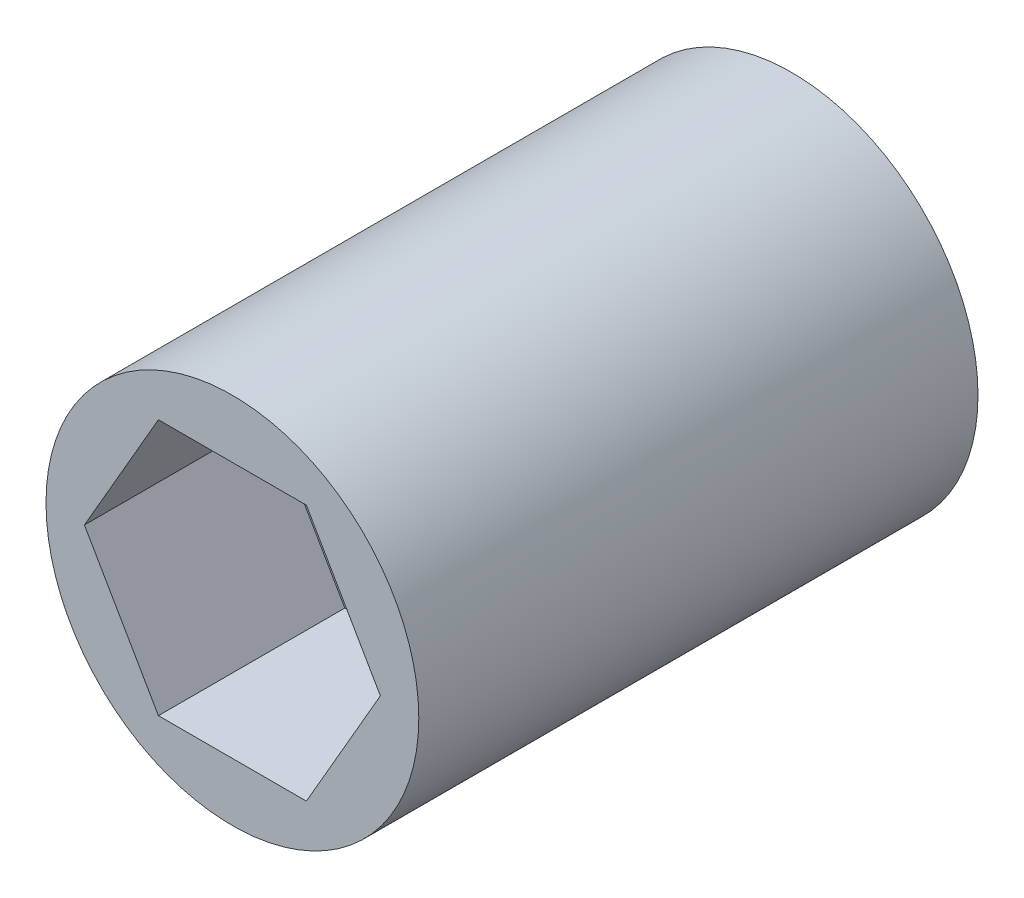
ISO-10303-21;
HEADER;
FILE_DESCRIPTION(('STEP AP214'),'2;1');
FILE_NAME('part.step','',(''),(''),'','','');
FILE_SCHEMA(('AUTOMOTIVE_DESIGN { 1 0 10303 214 1 1 1 1 }'));
ENDSEC;
DATA;
#1=APPLICATION_CONTEXT('core data for automotive mechanical design processes');
#2=APPLICATION_PROTOCOL_DEFINITION('international standard','automotive_design',2000,#1);
#3=PRODUCT_CONTEXT('',#1,'mechanical');
#4=PRODUCT('Part','Part','',(#3));
#5=PRODUCT_RELATED_PRODUCT_CATEGORY('part','',(#4));
#6=PRODUCT_DEFINITION_FORMATION('','',#4);
#7=PRODUCT_DEFINITION_CONTEXT('part definition',#1,'design');
#8=PRODUCT_DEFINITION('design','',#6,#7);
#9=PRODUCT_DEFINITION_SHAPE('','',#8);
#10=(LENGTH_UNIT() NAMED_UNIT(*) SI_UNIT(.MILLI.,.METRE.));
#11=(NAMED_UNIT(*) PLANE_ANGLE_UNIT() SI_UNIT($,.RADIAN.));
#12=(NAMED_UNIT(*) SI_UNIT($,.STERADIAN.) SOLID_ANGLE_UNIT());
#13=UNCERTAINTY_MEASURE_WITH_UNIT(LENGTH_MEASURE(1.E-05),#10,'distance_accuracy_value','');
#14=(GEOMETRIC_REPRESENTATION_CONTEXT(3) GLOBAL_UNCERTAINTY_ASSIGNED_CONTEXT((#13)) GLOBAL_UNIT_ASSIGNED_CONTEXT((#10,
#11,#12)) REPRESENTATION_CONTEXT('',''));
#15=CARTESIAN_POINT('',(0.,0.,0.));
#16=DIRECTION('',(0.,0.,1.));
#17=DIRECTION('',(1.,0.,0.));
#18=AXIS2_PLACEMENT_3D('',#15,#16,#17);
#19=CARTESIAN_POINT('',(0.,0.,0.));
#20=DIRECTION('',(0.,0.,1.));
#21=DIRECTION('',(1.,0.,0.));
#22=AXIS2_PLACEMENT_3D('',#19,#20,#21);
#23=PLANE('',#22);
#24=CARTESIAN_POINT('',(0.,0.,0.));
#25=DIRECTION('',(0.,0.,-1.));
#26=DIRECTION('',(-1.,0.,0.));
#27=AXIS2_PLACEMENT_3D('',#24,#25,#26);
#28=CIRCLE('',#27,1.5);
#29=CARTESIAN_POINT('',(1.5,0.,0.));
#30=VERTEX_POINT('',#29);
#31=EDGE_CURVE('E165',#30,#30,#28,.T.);
#32=ORIENTED_EDGE('',*,*,#31,.F.);
#33=EDGE_LOOP('',(#32));
#34=FACE_BOUND('',#33,.T.);
#35=CARTESIAN_POINT('',(0.,0.,0.));
#36=DIRECTION('',(0.,0.,1.));
#37=DIRECTION('',(1.,0.,0.));
#38=AXIS2_PLACEMENT_3D('',#35,#36,#37);
#39=CIRCLE('',#38,4.);
#40=CARTESIAN_POINT('',(4.,0.,0.));
#41=VERTEX_POINT('',#40);
#42=CARTESIAN_POINT('',(-4.,0.,0.));
#43=VERTEX_POINT('',#42);
#44=EDGE_CURVE('E10',#41,#43,#39,.T.);
#45=ORIENTED_EDGE('',*,*,#44,.F.);
#46=CARTESIAN_POINT('',(0.,0.,0.));
#47=DIRECTION('',(0.,0.,1.));
#48=DIRECTION('',(1.,0.,0.));
#49=AXIS2_PLACEMENT_3D('',#46,#47,#48);
#50=CIRCLE('',#49,4.);
#51=EDGE_CURVE('E26',#43,#41,#50,.T.);
#52=ORIENTED_EDGE('',*,*,#51,.F.);
#53=EDGE_LOOP('',(#45,#52));
#54=FACE_BOUND('',#53,.T.);
#55=ADVANCED_FACE('F15',(#34,#54),#23,.F.);
#56=CARTESIAN_POINT('',(0.,0.,12.));
#57=DIRECTION('',(0.,0.,1.));
#58=DIRECTION('',(1.,0.,0.));
#59=AXIS2_PLACEMENT_3D('',#56,#57,#58);
#60=PLANE('',#59);
#61=DIRECTION('',(-1.,0.,0.));
#62=VECTOR('',#61,1.);
#63=CARTESIAN_POINT('',(0.793856620135737,-2.75,12.));
#64=LINE('',#63,#62);
#65=CARTESIAN_POINT('',(1.58771324027147,-2.75,12.));
#66=VERTEX_POINT('',#65);
#67=CARTESIAN_POINT('',(-1.58771324027147,-2.75,12.));
#68=VERTEX_POINT('',#67);
#69=EDGE_CURVE('E127',#66,#68,#64,.T.);
#70=ORIENTED_EDGE('',*,*,#69,.T.);
#71=DIRECTION('',(-0.5,0.866025403784439,0.));
#72=VECTOR('',#71,1.);
#73=CARTESIAN_POINT('',(-1.98464155033934,-2.0625,12.));
#74=LINE('',#73,#72);
#75=CARTESIAN_POINT('',(-3.17542648054294,0.,12.));
#76=VERTEX_POINT('',#75);
#77=EDGE_CURVE('E111',#68,#76,#74,.T.);
#78=ORIENTED_EDGE('',*,*,#77,.T.);
#79=DIRECTION('',(0.5,0.866025403784439,0.));
#80=VECTOR('',#79,1.);
#81=CARTESIAN_POINT('',(-2.77849817047508,0.6875,12.));
#82=LINE('',#81,#80);
#83=CARTESIAN_POINT('',(-1.58771324027147,2.75,12.));
#84=VERTEX_POINT('',#83);
#85=EDGE_CURVE('E157',#76,#84,#82,.T.);
#86=ORIENTED_EDGE('',*,*,#85,.T.);
#87=DIRECTION('',(1.,0.,0.));
#88=VECTOR('',#87,1.);
#89=CARTESIAN_POINT('',(-0.793856620135739,2.75,12.));
#90=LINE('',#89,#88);
#91=CARTESIAN_POINT('',(1.58771324027147,2.75,12.));
#92=VERTEX_POINT('',#91);
#93=EDGE_CURVE('E186',#84,#92,#90,.T.);
#94=ORIENTED_EDGE('',*,*,#93,.T.);
#95=DIRECTION('',(0.5,-0.866025403784439,0.));
#96=VECTOR('',#95,1.);
#97=CARTESIAN_POINT('',(1.98464155033934,2.0625,12.));
#98=LINE('',#97,#96);
#99=CARTESIAN_POINT('',(3.17542648054294,0.,12.));
#100=VERTEX_POINT('',#99);
#101=EDGE_CURVE('E152',#92,#100,#98,.T.);
#102=ORIENTED_EDGE('',*,*,#101,.T.);
#103=DIRECTION('',(-0.5,-0.866025403784439,0.));
#104=VECTOR('',#103,1.);
#105=CARTESIAN_POINT('',(2.77849817047507,-0.6875,12.));
#106=LINE('',#105,#104);
#107=EDGE_CURVE('E131',#100,#66,#106,.T.);
#108=ORIENTED_EDGE('',*,*,#107,.T.);
#109=EDGE_LOOP('',(#70,#78,#86,#94,#102,#108));
#110=FACE_BOUND('',#109,.T.);
#111=CARTESIAN_POINT('',(0.,0.,12.));
#112=DIRECTION('',(0.,0.,1.));
#113=DIRECTION('',(1.,0.,0.));
#114=AXIS2_PLACEMENT_3D('',#111,#112,#113);
#115=CIRCLE('',#114,4.);
#116=CARTESIAN_POINT('',(4.,0.,12.));
#117=VERTEX_POINT('',#116);
#118=CARTESIAN_POINT('',(-4.,0.,12.));
#119=VERTEX_POINT('',#118);
#120=EDGE_CURVE('E161',#117,#119,#115,.T.);
#121=ORIENTED_EDGE('',*,*,#120,.T.);
#122=CARTESIAN_POINT('',(0.,0.,12.));
#123=DIRECTION('',(0.,0.,1.));
#124=DIRECTION('',(1.,0.,0.));
#125=AXIS2_PLACEMENT_3D('',#122,#123,#124);
#126=CIRCLE('',#125,4.);
#127=EDGE_CURVE('E151',#119,#117,#126,.T.);
#128=ORIENTED_EDGE('',*,*,#127,.T.);
#129=EDGE_LOOP('',(#121,#128));
#130=FACE_BOUND('',#129,.T.);
#131=ADVANCED_FACE('F133',(#110,#130),#60,.T.);
#132=CARTESIAN_POINT('',(0.,0.,0.));
#133=DIRECTION('',(0.,0.,1.));
#134=DIRECTION('',(1.,0.,0.));
#135=AXIS2_PLACEMENT_3D('',#132,#133,#134);
#136=CYLINDRICAL_SURFACE('',#135,4.);
#137=ORIENTED_EDGE('',*,*,#120,.F.);
#138=ORIENTED_EDGE('',*,*,#127,.F.);
#139=DIRECTION('',(0.,0.,-1.));
#140=VECTOR('',#139,1.);
#141=CARTESIAN_POINT('',(-4.,0.,0.));
#142=LINE('',#141,#140);
#143=EDGE_CURVE('E147',#119,#43,#142,.T.);
#144=ORIENTED_EDGE('',*,*,#143,.T.);
#145=ORIENTED_EDGE('',*,*,#51,.T.);
#146=ORIENTED_EDGE('',*,*,#44,.T.);
#147=ORIENTED_EDGE('',*,*,#143,.F.);
#148=EDGE_LOOP('',(#137,#138,#144,#145,#146,#147));
#149=FACE_BOUND('',#148,.T.);
#150=ADVANCED_FACE('F198',(#149),#136,.T.);
#151=CARTESIAN_POINT('',(0.,0.,0.));
#152=DIRECTION('',(0.,0.,1.));
#153=DIRECTION('',(-1.,0.,0.));
#154=AXIS2_PLACEMENT_3D('',#151,#152,#153);
#155=CYLINDRICAL_SURFACE('',#154,1.5);
#156=CARTESIAN_POINT('',(0.,0.,8.));
#157=DIRECTION('',(0.,0.,1.));
#158=DIRECTION('',(-1.,0.,0.));
#159=AXIS2_PLACEMENT_3D('',#156,#157,#158);
#160=CIRCLE('',#159,1.5);
#161=CARTESIAN_POINT('',(1.5,0.,8.));
#162=VERTEX_POINT('',#161);
#163=EDGE_CURVE('E168',#162,#162,#160,.T.);
#164=ORIENTED_EDGE('',*,*,#163,.T.);
#165=DIRECTION('',(0.,0.,-1.));
#166=VECTOR('',#165,1.);
#167=CARTESIAN_POINT('',(1.5,0.,0.));
#168=LINE('',#167,#166);
#169=EDGE_CURVE('E101',#162,#30,#168,.T.);
#170=ORIENTED_EDGE('',*,*,#169,.T.);
#171=ORIENTED_EDGE('',*,*,#31,.T.);
#172=ORIENTED_EDGE('',*,*,#169,.F.);
#173=EDGE_LOOP('',(#164,#170,#171,#172));
#174=FACE_BOUND('',#173,.T.);
#175=ADVANCED_FACE('F214',(#174),#155,.F.);
#176=CARTESIAN_POINT('',(0.,0.,8.));
#177=DIRECTION('',(0.,0.,-1.));
#178=DIRECTION('',(0.,-1.,0.));
#179=AXIS2_PLACEMENT_3D('',#176,#177,#178);
#180=PLANE('',#179);
#181=ORIENTED_EDGE('',*,*,#163,.F.);
#182=EDGE_LOOP('',(#181));
#183=FACE_BOUND('',#182,.T.);
#184=DIRECTION('',(-0.5,0.866025403784439,0.));
#185=VECTOR('',#184,1.);
#186=CARTESIAN_POINT('',(-3.17542648054294,0.,8.));
#187=LINE('',#186,#185);
#188=CARTESIAN_POINT('',(-1.58771324027147,-2.75,8.));
#189=VERTEX_POINT('',#188);
#190=CARTESIAN_POINT('',(-3.17542648054294,0.,8.));
#191=VERTEX_POINT('',#190);
#192=EDGE_CURVE('E90',#189,#191,#187,.T.);
#193=ORIENTED_EDGE('',*,*,#192,.F.);
#194=DIRECTION('',(-1.,0.,0.));
#195=VECTOR('',#194,1.);
#196=CARTESIAN_POINT('',(-1.58771324027147,-2.75,8.));
#197=LINE('',#196,#195);
#198=CARTESIAN_POINT('',(1.58771324027147,-2.75,8.));
#199=VERTEX_POINT('',#198);
#200=EDGE_CURVE('E129',#199,#189,#197,.T.);
#201=ORIENTED_EDGE('',*,*,#200,.F.);
#202=DIRECTION('',(-0.5,-0.866025403784439,0.));
#203=VECTOR('',#202,1.);
#204=CARTESIAN_POINT('',(1.58771324027147,-2.75,8.));
#205=LINE('',#204,#203);
#206=CARTESIAN_POINT('',(3.17542648054294,0.,8.));
#207=VERTEX_POINT('',#206);
#208=EDGE_CURVE('E156',#207,#199,#205,.T.);
#209=ORIENTED_EDGE('',*,*,#208,.F.);
#210=DIRECTION('',(0.5,-0.866025403784439,0.));
#211=VECTOR('',#210,1.);
#212=CARTESIAN_POINT('',(3.17542648054294,0.,8.));
#213=LINE('',#212,#211);
#214=CARTESIAN_POINT('',(1.58771324027147,2.75,8.));
#215=VERTEX_POINT('',#214);
#216=EDGE_CURVE('E238',#215,#207,#213,.T.);
#217=ORIENTED_EDGE('',*,*,#216,.F.);
#218=DIRECTION('',(1.,0.,0.));
#219=VECTOR('',#218,1.);
#220=CARTESIAN_POINT('',(1.58771324027147,2.75,8.));
#221=LINE('',#220,#219);
#222=CARTESIAN_POINT('',(-1.58771324027147,2.75,8.));
#223=VERTEX_POINT('',#222);
#224=EDGE_CURVE('E160',#223,#215,#221,.T.);
#225=ORIENTED_EDGE('',*,*,#224,.F.);
#226=DIRECTION('',(0.5,0.866025403784439,0.));
#227=VECTOR('',#226,1.);
#228=CARTESIAN_POINT('',(-1.58771324027147,2.75,8.));
#229=LINE('',#228,#227);
#230=EDGE_CURVE('E121',#191,#223,#229,.T.);
#231=ORIENTED_EDGE('',*,*,#230,.F.);
#232=EDGE_LOOP('',(#193,#201,#209,#217,#225,#231));
#233=FACE_BOUND('',#232,.T.);
#234=ADVANCED_FACE('F217',(#183,#233),#180,.F.);
#235=CARTESIAN_POINT('',(-1.58771324027147,-2.75,12.));
#236=DIRECTION('',(-0.866025403784439,-0.5,0.));
#237=DIRECTION('',(-0.5,0.866025403784439,0.));
#238=AXIS2_PLACEMENT_3D('',#235,#236,#237);
#239=PLANE('',#238);
#240=ORIENTED_EDGE('',*,*,#77,.F.);
#241=DIRECTION('',(0.,0.,-1.));
#242=VECTOR('',#241,1.);
#243=CARTESIAN_POINT('',(-1.58771324027147,-2.75,12.));
#244=LINE('',#243,#242);
#245=EDGE_CURVE('E114',#68,#189,#244,.T.);
#246=ORIENTED_EDGE('',*,*,#245,.T.);
#247=ORIENTED_EDGE('',*,*,#192,.T.);
#248=DIRECTION('',(0.,0.,-1.));
#249=VECTOR('',#248,1.);
#250=CARTESIAN_POINT('',(-3.17542648054294,0.,12.));
#251=LINE('',#250,#249);
#252=EDGE_CURVE('E19',#76,#191,#251,.T.);
#253=ORIENTED_EDGE('',*,*,#252,.F.);
#254=EDGE_LOOP('',(#240,#246,#247,#253));
#255=FACE_BOUND('',#254,.T.);
#256=ADVANCED_FACE('F113',(#255),#239,.F.);
#257=CARTESIAN_POINT('',(-3.17542648054294,0.,12.));
#258=DIRECTION('',(-0.866025403784439,0.5,0.));
#259=DIRECTION('',(0.,0.,1.));
#260=AXIS2_PLACEMENT_3D('',#257,#258,#259);
#261=PLANE('',#260);
#262=ORIENTED_EDGE('',*,*,#85,.F.);
#263=ORIENTED_EDGE('',*,*,#252,.T.);
#264=ORIENTED_EDGE('',*,*,#230,.T.);
#265=DIRECTION('',(0.,0.,-1.));
#266=VECTOR('',#265,1.);
#267=CARTESIAN_POINT('',(-1.58771324027147,2.75,12.));
#268=LINE('',#267,#266);
#269=EDGE_CURVE('E234',#84,#223,#268,.T.);
#270=ORIENTED_EDGE('',*,*,#269,.F.);
#271=EDGE_LOOP('',(#262,#263,#264,#270));
#272=FACE_BOUND('',#271,.T.);
#273=ADVANCED_FACE('F222',(#272),#261,.F.);
#274=CARTESIAN_POINT('',(-1.58771324027147,2.75,12.));
#275=DIRECTION('',(0.,1.,0.));
#276=DIRECTION('',(1.,0.,0.));
#277=AXIS2_PLACEMENT_3D('',#274,#275,#276);
#278=PLANE('',#277);
#279=ORIENTED_EDGE('',*,*,#93,.F.);
#280=ORIENTED_EDGE('',*,*,#269,.T.);
#281=ORIENTED_EDGE('',*,*,#224,.T.);
#282=DIRECTION('',(0.,0.,-1.));
#283=VECTOR('',#282,1.);
#284=CARTESIAN_POINT('',(1.58771324027147,2.75,12.));
#285=LINE('',#284,#283);
#286=EDGE_CURVE('E155',#92,#215,#285,.T.);
#287=ORIENTED_EDGE('',*,*,#286,.F.);
#288=EDGE_LOOP('',(#279,#280,#281,#287));
#289=FACE_BOUND('',#288,.T.);
#290=ADVANCED_FACE('F220',(#289),#278,.F.);
#291=CARTESIAN_POINT('',(1.58771324027147,2.75,12.));
#292=DIRECTION('',(0.866025403784439,0.5,0.));
#293=DIRECTION('',(0.,0.,-1.));
#294=AXIS2_PLACEMENT_3D('',#291,#292,#293);
#295=PLANE('',#294);
#296=ORIENTED_EDGE('',*,*,#101,.F.);
#297=ORIENTED_EDGE('',*,*,#286,.T.);
#298=ORIENTED_EDGE('',*,*,#216,.T.);
#299=DIRECTION('',(0.,0.,-1.));
#300=VECTOR('',#299,1.);
#301=CARTESIAN_POINT('',(3.17542648054294,0.,12.));
#302=LINE('',#301,#300);
#303=EDGE_CURVE('E171',#100,#207,#302,.T.);
#304=ORIENTED_EDGE('',*,*,#303,.F.);
#305=EDGE_LOOP('',(#296,#297,#298,#304));
#306=FACE_BOUND('',#305,.T.);
#307=ADVANCED_FACE('F210',(#306),#295,.F.);
#308=CARTESIAN_POINT('',(3.17542648054294,0.,12.));
#309=DIRECTION('',(0.866025403784439,-0.5,0.));
#310=DIRECTION('',(0.,0.,-1.));
#311=AXIS2_PLACEMENT_3D('',#308,#309,#310);
#312=PLANE('',#311);
#313=ORIENTED_EDGE('',*,*,#107,.F.);
#314=ORIENTED_EDGE('',*,*,#303,.T.);
#315=ORIENTED_EDGE('',*,*,#208,.T.);
#316=DIRECTION('',(0.,0.,-1.));
#317=VECTOR('',#316,1.);
#318=CARTESIAN_POINT('',(1.58771324027147,-2.75,12.));
#319=LINE('',#318,#317);
#320=EDGE_CURVE('E138',#66,#199,#319,.T.);
#321=ORIENTED_EDGE('',*,*,#320,.F.);
#322=EDGE_LOOP('',(#313,#314,#315,#321));
#323=FACE_BOUND('',#322,.T.);
#324=ADVANCED_FACE('F17',(#323),#312,.F.);
#325=CARTESIAN_POINT('',(1.58771324027147,-2.75,12.));
#326=DIRECTION('',(0.,-1.,0.));
#327=DIRECTION('',(0.,0.,-1.));
#328=AXIS2_PLACEMENT_3D('',#325,#326,#327);
#329=PLANE('',#328);
#330=ORIENTED_EDGE('',*,*,#69,.F.);
#331=ORIENTED_EDGE('',*,*,#320,.T.);
#332=ORIENTED_EDGE('',*,*,#200,.T.);
#333=ORIENTED_EDGE('',*,*,#245,.F.);
#334=EDGE_LOOP('',(#330,#331,#332,#333));
#335=FACE_BOUND('',#334,.T.);
#336=ADVANCED_FACE('F125',(#335),#329,.F.);
#337=CLOSED_SHELL('',(#55,#131,#150,#175,#234,#256,#273,#290,#307,#324,#336));
#338=MANIFOLD_SOLID_BREP('B1',#337);
#339=ADVANCED_BREP_SHAPE_REPRESENTATION('',(#18,#338),#14);
#340=SHAPE_DEFINITION_REPRESENTATION(#9,#339);
ENDSEC;
END-ISO-10303-21;
